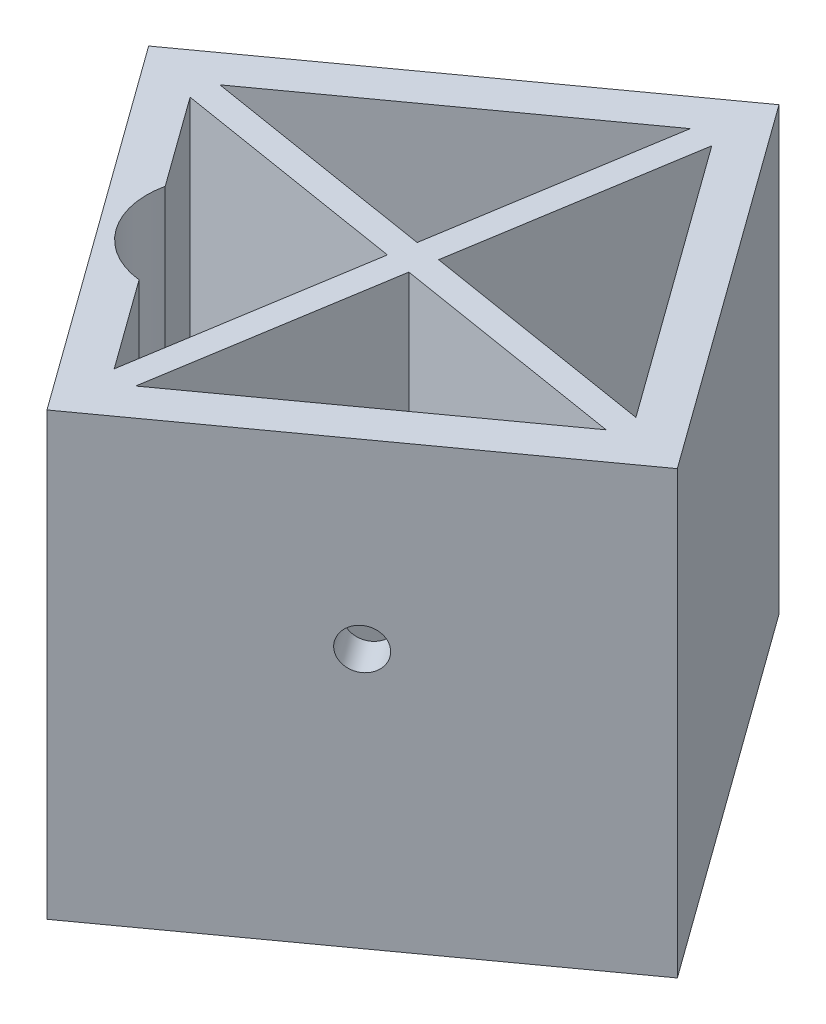
ISO-10303-21;
HEADER;
FILE_DESCRIPTION(('STEP AP214'),'2;1');
FILE_NAME('part.step','',(''),(''),'','','');
FILE_SCHEMA(('AUTOMOTIVE_DESIGN { 1 0 10303 214 1 1 1 1 }'));
ENDSEC;
DATA;
#1=APPLICATION_CONTEXT('core data for automotive mechanical design processes');
#2=APPLICATION_PROTOCOL_DEFINITION('international standard','automotive_design',2000,#1);
#3=PRODUCT_CONTEXT('',#1,'mechanical');
#4=PRODUCT('Part','Part','',(#3));
#5=PRODUCT_RELATED_PRODUCT_CATEGORY('part','',(#4));
#6=PRODUCT_DEFINITION_FORMATION('','',#4);
#7=PRODUCT_DEFINITION_CONTEXT('part definition',#1,'design');
#8=PRODUCT_DEFINITION('design','',#6,#7);
#9=PRODUCT_DEFINITION_SHAPE('','',#8);
#10=(LENGTH_UNIT() NAMED_UNIT(*) SI_UNIT(.MILLI.,.METRE.));
#11=(NAMED_UNIT(*) PLANE_ANGLE_UNIT() SI_UNIT($,.RADIAN.));
#12=(NAMED_UNIT(*) SI_UNIT($,.STERADIAN.) SOLID_ANGLE_UNIT());
#13=UNCERTAINTY_MEASURE_WITH_UNIT(LENGTH_MEASURE(1.E-05),#10,'distance_accuracy_value','');
#14=(GEOMETRIC_REPRESENTATION_CONTEXT(3) GLOBAL_UNCERTAINTY_ASSIGNED_CONTEXT((#13)) GLOBAL_UNIT_ASSIGNED_CONTEXT((#10,
#11,#12)) REPRESENTATION_CONTEXT('',''));
#15=CARTESIAN_POINT('',(0.,0.,0.));
#16=DIRECTION('',(0.,0.,1.));
#17=DIRECTION('',(1.,0.,0.));
#18=AXIS2_PLACEMENT_3D('',#15,#16,#17);
#19=CARTESIAN_POINT('',(0.,2.54,0.));
#20=DIRECTION('',(0.,1.,0.));
#21=DIRECTION('',(0.,0.,1.));
#22=AXIS2_PLACEMENT_3D('',#19,#20,#21);
#23=PLANE('',#22);
#24=DIRECTION('',(0.159232438824621,0.,-0.987241120712647));
#25=VECTOR('',#24,1.);
#26=CARTESIAN_POINT('',(-93.1889043607743,2.54,-15.0304684452862));
#27=LINE('',#26,#25);
#28=CARTESIAN_POINT('',(-108.848549962769,2.54,82.0593342870785));
#29=VERTEX_POINT('',#28);
#30=CARTESIAN_POINT('',(-108.421598003368,2.54,79.4122321387932));
#31=VERTEX_POINT('',#30);
#32=EDGE_CURVE('E342',#29,#31,#27,.T.);
#33=ORIENTED_EDGE('',*,*,#32,.F.);
#34=DIRECTION('',(0.810679228399881,0.,-0.585490553844359));
#35=VECTOR('',#34,1.);
#36=CARTESIAN_POINT('',(-100.626682754743,2.54,76.1213190812824));
#37=LINE('',#36,#35);
#38=CARTESIAN_POINT('',(-105.774495855082,2.54,79.839184098194));
#39=VERTEX_POINT('',#38);
#40=EDGE_CURVE('E333',#29,#39,#37,.T.);
#41=ORIENTED_EDGE('',*,*,#40,.T.);
#42=DIRECTION('',(-0.987241120712647,0.,-0.159232438824621));
#43=VECTOR('',#42,1.);
#44=CARTESIAN_POINT('',(-15.2326936425935,2.54,94.4427005840794));
#45=LINE('',#44,#43);
#46=EDGE_CURVE('E340',#39,#31,#45,.T.);
#47=ORIENTED_EDGE('',*,*,#46,.T.);
#48=EDGE_LOOP('',(#33,#41,#47));
#49=FACE_BOUND('',#48,.T.);
#50=ADVANCED_FACE('F34',(#49),#23,.T.);
#51=DIRECTION('',(0.159232438824621,0.,-0.987241120712647));
#52=VECTOR('',#51,1.);
#53=CARTESIAN_POINT('',(-93.1889043607743,2.54,-15.0304684452862));
#54=LINE('',#53,#52);
#55=CARTESIAN_POINT('',(-108.219372806061,2.54,78.1584359154881));
#56=VERTEX_POINT('',#55);
#57=CARTESIAN_POINT('',(-106.362472763232,2.54,66.6456556499519));
#58=VERTEX_POINT('',#57);
#59=EDGE_CURVE('E350',#56,#58,#54,.T.);
#60=ORIENTED_EDGE('',*,*,#59,.F.);
#61=DIRECTION('',(-0.987241120712647,0.,-0.159232438824621));
#62=VECTOR('',#61,1.);
#63=CARTESIAN_POINT('',(-15.0304684452863,2.54,93.1889043607744));
#64=LINE('',#63,#62);
#65=CARTESIAN_POINT('',(-96.7065925405243,2.54,80.0153359583165));
#66=VERTEX_POINT('',#65);
#67=EDGE_CURVE('E347',#66,#56,#64,.T.);
#68=ORIENTED_EDGE('',*,*,#67,.F.);
#69=DIRECTION('',(-0.585490553844359,0.,-0.81067922839988));
#70=VECTOR('',#69,1.);
#71=CARTESIAN_POINT('',(-96.1808070275254,2.54,80.7433466686227));
#72=LINE('',#71,#70);
#73=EDGE_CURVE('E272',#66,#58,#72,.T.);
#74=ORIENTED_EDGE('',*,*,#73,.T.);
#75=EDGE_LOOP('',(#60,#68,#74));
#76=FACE_BOUND('',#75,.T.);
#77=ADVANCED_FACE('F416',(#76),#23,.T.);
#78=DIRECTION('',(-0.987241120712647,0.,-0.159232438824621));
#79=VECTOR('',#78,1.);
#80=CARTESIAN_POINT('',(-15.2326936425935,2.54,94.4427005840794));
#81=LINE('',#80,#79);
#82=CARTESIAN_POINT('',(-109.675394226673,2.54,79.2100069414859));
#83=VERTEX_POINT('',#82);
#84=CARTESIAN_POINT('',(-121.188174492209,2.54,77.3531068986575));
#85=VERTEX_POINT('',#84);
#86=EDGE_CURVE('E222',#83,#85,#81,.T.);
#87=ORIENTED_EDGE('',*,*,#86,.T.);
#88=DIRECTION('',(0.585490553844354,0.,0.810679228399884));
#89=VECTOR('',#88,1.);
#90=CARTESIAN_POINT('',(-121.713960005208,2.54,76.6250961883513));
#91=LINE('',#90,#89);
#92=CARTESIAN_POINT('',(-118.022197337776,2.54,81.7367675740266));
#93=VERTEX_POINT('',#92);
#94=EDGE_CURVE('E275',#85,#93,#91,.T.);
#95=ORIENTED_EDGE('',*,*,#94,.T.);
#96=CARTESIAN_POINT('',(-114.3,2.54,82.55));
#97=DIRECTION('',(0.,1.,0.));
#98=DIRECTION('',(0.,0.,1.));
#99=AXIS2_PLACEMENT_3D('',#96,#97,#98);
#100=CIRCLE('',#99,3.81);
#101=CARTESIAN_POINT('',(-114.698271423935,2.54,86.3391265316531));
#102=VERTEX_POINT('',#101);
#103=EDGE_CURVE('E278',#93,#102,#100,.T.);
#104=ORIENTED_EDGE('',*,*,#103,.T.);
#105=DIRECTION('',(0.585490553844358,0.,0.810679228399882));
#106=VECTOR('',#105,1.);
#107=CARTESIAN_POINT('',(-114.698271423935,2.54,86.3391265316531));
#108=LINE('',#107,#106);
#109=CARTESIAN_POINT('',(-111.532294269501,2.54,90.7227872070222));
#110=VERTEX_POINT('',#109);
#111=EDGE_CURVE('E259',#102,#110,#108,.T.);
#112=ORIENTED_EDGE('',*,*,#111,.T.);
#113=DIRECTION('',(0.159232438824621,0.,-0.987241120712647));
#114=VECTOR('',#113,1.);
#115=CARTESIAN_POINT('',(-94.4427005840794,2.54,-15.2326936425935));
#116=LINE('',#115,#114);
#117=EDGE_CURVE('E352',#110,#83,#116,.T.);
#118=ORIENTED_EDGE('',*,*,#117,.T.);
#119=EDGE_LOOP('',(#87,#95,#104,#112,#118));
#120=FACE_BOUND('',#119,.T.);
#121=CARTESIAN_POINT('',(-114.3,2.54,82.55));
#122=DIRECTION('',(0.,1.,0.));
#123=DIRECTION('',(0.,0.,1.));
#124=AXIS2_PLACEMENT_3D('',#121,#122,#123);
#125=CIRCLE('',#124,1.5);
#126=CARTESIAN_POINT('',(-114.3,2.54,84.05));
#127=VERTEX_POINT('',#126);
#128=EDGE_CURVE('E300',#127,#127,#125,.T.);
#129=ORIENTED_EDGE('',*,*,#128,.F.);
#130=EDGE_LOOP('',(#129));
#131=FACE_BOUND('',#130,.T.);
#132=ADVANCED_FACE('F410',(#120,#131),#23,.T.);
#133=CARTESIAN_POINT('',(-96.1808070275254,21.59,80.7433466686227));
#134=DIRECTION('',(-0.81067922839988,0.,0.585490553844359));
#135=DIRECTION('',(0.585490553844359,0.,0.81067922839988));
#136=AXIS2_PLACEMENT_3D('',#133,#134,#135);
#137=PLANE('',#136);
#138=ORIENTED_EDGE('',*,*,#73,.F.);
#139=DIRECTION('',(0.,1.,0.));
#140=VECTOR('',#139,1.);
#141=CARTESIAN_POINT('',(-96.7065925405243,-33.5693312311857,80.0153359583166));
#142=LINE('',#141,#140);
#143=CARTESIAN_POINT('',(-96.7065925405243,21.59,80.0153359583166));
#144=VERTEX_POINT('',#143);
#145=EDGE_CURVE('E235',#66,#144,#142,.T.);
#146=ORIENTED_EDGE('',*,*,#145,.T.);
#147=DIRECTION('',(-0.585490553844359,0.,-0.81067922839988));
#148=VECTOR('',#147,1.);
#149=CARTESIAN_POINT('',(-96.1808070275254,21.59,80.7433466686227));
#150=LINE('',#149,#148);
#151=CARTESIAN_POINT('',(-106.362472763232,21.59,66.6456556499519));
#152=VERTEX_POINT('',#151);
#153=EDGE_CURVE('E256',#144,#152,#150,.T.);
#154=ORIENTED_EDGE('',*,*,#153,.T.);
#155=DIRECTION('',(0.,1.,0.));
#156=VECTOR('',#155,1.);
#157=CARTESIAN_POINT('',(-106.362472763232,-33.5693312311857,66.6456556499519));
#158=LINE('',#157,#156);
#159=EDGE_CURVE('E223',#58,#152,#158,.T.);
#160=ORIENTED_EDGE('',*,*,#159,.F.);
#161=EDGE_LOOP('',(#138,#146,#154,#160));
#162=FACE_BOUND('',#161,.T.);
#163=ADVANCED_FACE('F400',(#162),#137,.T.);
#164=CARTESIAN_POINT('',(-106.888258276231,21.59,65.9176449396458));
#165=DIRECTION('',(0.58549055384436,0.,0.81067922839988));
#166=DIRECTION('',(0.81067922839988,0.,-0.58549055384436));
#167=AXIS2_PLACEMENT_3D('',#164,#165,#166);
#168=PLANE('',#167);
#169=CARTESIAN_POINT('',(-114.301109140719,12.7,71.2713705639986));
#170=DIRECTION('',(0.58549055384436,0.,0.81067922839988));
#171=DIRECTION('',(0.81067922839988,0.,-0.58549055384436));
#172=AXIS2_PLACEMENT_3D('',#169,#170,#171);
#173=CIRCLE('',#172,1.);
#174=CARTESIAN_POINT('',(-113.49042991232,12.7,70.6858800101542));
#175=VERTEX_POINT('',#174);
#176=EDGE_CURVE('E364',#175,#175,#173,.T.);
#177=ORIENTED_EDGE('',*,*,#176,.F.);
#178=EDGE_LOOP('',(#177));
#179=FACE_BOUND('',#178,.T.);
#180=DIRECTION('',(0.,1.,0.));
#181=VECTOR('',#180,1.);
#182=CARTESIAN_POINT('',(-120.985949294902,-33.5693312311857,76.0993106753524));
#183=LINE('',#182,#181);
#184=CARTESIAN_POINT('',(-120.985949294902,8.88999999999999,76.0993106753524));
#185=VERTEX_POINT('',#184);
#186=CARTESIAN_POINT('',(-120.985949294902,21.59,76.0993106753524));
#187=VERTEX_POINT('',#186);
#188=EDGE_CURVE('E254',#185,#187,#183,.T.);
#189=ORIENTED_EDGE('',*,*,#188,.F.);
#190=DIRECTION('',(-0.81067922839988,0.,0.58549055384436));
#191=VECTOR('',#190,1.);
#192=CARTESIAN_POINT('',(-107.616268986537,8.89,66.4434304526447));
#193=LINE('',#192,#191);
#194=CARTESIAN_POINT('',(-107.616268986537,8.88999999999999,66.4434304526446));
#195=VERTEX_POINT('',#194);
#196=EDGE_CURVE('E329',#185,#195,#193,.F.);
#197=ORIENTED_EDGE('',*,*,#196,.T.);
#198=DIRECTION('',(0.,1.,0.));
#199=VECTOR('',#198,1.);
#200=CARTESIAN_POINT('',(-107.616268986537,-33.5693312311857,66.4434304526446));
#201=LINE('',#200,#199);
#202=CARTESIAN_POINT('',(-107.616268986537,21.59,66.4434304526447));
#203=VERTEX_POINT('',#202);
#204=EDGE_CURVE('E220',#195,#203,#201,.T.);
#205=ORIENTED_EDGE('',*,*,#204,.T.);
#206=DIRECTION('',(-0.81067922839988,0.,0.58549055384436));
#207=VECTOR('',#206,1.);
#208=CARTESIAN_POINT('',(-106.888258276231,21.59,65.9176449396458));
#209=LINE('',#208,#207);
#210=EDGE_CURVE('E258',#203,#187,#209,.T.);
#211=ORIENTED_EDGE('',*,*,#210,.T.);
#212=EDGE_LOOP('',(#189,#197,#205,#211));
#213=FACE_BOUND('',#212,.T.);
#214=ADVANCED_FACE('F397',(#179,#213),#168,.T.);
#215=CARTESIAN_POINT('',(-111.006508756502,21.59,91.4507979173283));
#216=DIRECTION('',(-0.585490553844359,0.,-0.810679228399881));
#217=DIRECTION('',(-0.810679228399881,0.,0.585490553844359));
#218=AXIS2_PLACEMENT_3D('',#215,#216,#217);
#219=PLANE('',#218);
#220=CARTESIAN_POINT('',(-103.593657892014,12.7,86.0970722929755));
#221=DIRECTION('',(-0.585490553844359,0.,-0.810679228399881));
#222=DIRECTION('',(-0.810679228399881,0.,0.585490553844359));
#223=AXIS2_PLACEMENT_3D('',#220,#221,#222);
#224=CIRCLE('',#223,1.);
#225=CARTESIAN_POINT('',(-104.404337120414,12.7,86.6825628468199));
#226=VERTEX_POINT('',#225);
#227=EDGE_CURVE('E562',#226,#226,#224,.T.);
#228=ORIENTED_EDGE('',*,*,#227,.F.);
#229=EDGE_LOOP('',(#228));
#230=FACE_BOUND('',#229,.T.);
#231=DIRECTION('',(0.,1.,0.));
#232=VECTOR('',#231,1.);
#233=CARTESIAN_POINT('',(-96.9088177378316,-33.5693312311857,81.2691321816216));
#234=LINE('',#233,#232);
#235=CARTESIAN_POINT('',(-96.9088177378316,8.88999999999999,81.2691321816216));
#236=VERTEX_POINT('',#235);
#237=CARTESIAN_POINT('',(-96.9088177378316,21.59,81.2691321816216));
#238=VERTEX_POINT('',#237);
#239=EDGE_CURVE('E237',#236,#238,#234,.T.);
#240=ORIENTED_EDGE('',*,*,#239,.F.);
#241=DIRECTION('',(0.810679228399881,0.,-0.585490553844359));
#242=VECTOR('',#241,1.);
#243=CARTESIAN_POINT('',(-110.278498046196,8.89,90.9250124043294));
#244=LINE('',#243,#242);
#245=CARTESIAN_POINT('',(-110.278498046196,8.88999999999999,90.9250124043294));
#246=VERTEX_POINT('',#245);
#247=EDGE_CURVE('E42',#236,#246,#244,.F.);
#248=ORIENTED_EDGE('',*,*,#247,.T.);
#249=DIRECTION('',(0.,1.,0.));
#250=VECTOR('',#249,1.);
#251=CARTESIAN_POINT('',(-110.278498046196,-33.5693312311857,90.9250124043294));
#252=LINE('',#251,#250);
#253=CARTESIAN_POINT('',(-110.278498046196,21.59,90.9250124043294));
#254=VERTEX_POINT('',#253);
#255=EDGE_CURVE('E243',#246,#254,#252,.T.);
#256=ORIENTED_EDGE('',*,*,#255,.T.);
#257=DIRECTION('',(0.810679228399881,0.,-0.585490553844359));
#258=VECTOR('',#257,1.);
#259=CARTESIAN_POINT('',(-111.006508756502,21.59,91.4507979173283));
#260=LINE('',#259,#258);
#261=EDGE_CURVE('E268',#254,#238,#260,.T.);
#262=ORIENTED_EDGE('',*,*,#261,.T.);
#263=EDGE_LOOP('',(#240,#248,#256,#262));
#264=FACE_BOUND('',#263,.T.);
#265=ADVANCED_FACE('F399',(#230,#264),#219,.T.);
#266=CARTESIAN_POINT('',(-99.9901887217764,2.54,72.2151362990608));
#267=DIRECTION('',(-0.810679228399881,0.,0.585490553844359));
#268=DIRECTION('',(0.585490553844359,0.,0.81067922839988));
#269=AXIS2_PLACEMENT_3D('',#266,#267,#268);
#270=PLANE('',#269);
#271=DIRECTION('',(-0.585490553844359,0.,-0.810679228399881));
#272=VECTOR('',#271,1.);
#273=CARTESIAN_POINT('',(-99.9901887217764,0.,72.2151362990608));
#274=LINE('',#273,#272);
#275=CARTESIAN_POINT('',(-93.5211035923501,0.,81.172331093651));
#276=VERTEX_POINT('',#275);
#277=CARTESIAN_POINT('',(-106.459273851203,0.,63.2579415044705));
#278=VERTEX_POINT('',#277);
#279=EDGE_CURVE('E307',#276,#278,#274,.T.);
#280=ORIENTED_EDGE('',*,*,#279,.T.);
#281=DIRECTION('',(0.,-1.,0.));
#282=VECTOR('',#281,1.);
#283=CARTESIAN_POINT('',(-106.459273851203,2.54,63.2579415044705));
#284=LINE('',#283,#282);
#285=CARTESIAN_POINT('',(-106.459273851203,21.59,63.2579415044705));
#286=VERTEX_POINT('',#285);
#287=EDGE_CURVE('E202',#286,#278,#284,.T.);
#288=ORIENTED_EDGE('',*,*,#287,.F.);
#289=DIRECTION('',(-0.58549055384436,0.,-0.81067922839988));
#290=VECTOR('',#289,1.);
#291=CARTESIAN_POINT('',(-93.5211035923501,21.59,81.172331093651));
#292=LINE('',#291,#290);
#293=CARTESIAN_POINT('',(-93.5211035923501,21.59,81.172331093651));
#294=VERTEX_POINT('',#293);
#295=EDGE_CURVE('E287',#294,#286,#292,.T.);
#296=ORIENTED_EDGE('',*,*,#295,.F.);
#297=DIRECTION('',(0.,-1.,0.));
#298=VECTOR('',#297,1.);
#299=CARTESIAN_POINT('',(-93.5211035923501,2.54,81.172331093651));
#300=LINE('',#299,#298);
#301=EDGE_CURVE('E303',#294,#276,#300,.T.);
#302=ORIENTED_EDGE('',*,*,#301,.T.);
#303=EDGE_LOOP('',(#280,#288,#296,#302));
#304=FACE_BOUND('',#303,.T.);
#305=ADVANCED_FACE('F407',(#304),#270,.F.);
#306=CARTESIAN_POINT('',(-6.46908512942643,2.54,-8.95719479459041));
#307=DIRECTION('',(0.58549055384436,0.,0.81067922839988));
#308=DIRECTION('',(0.81067922839988,0.,-0.58549055384436));
#309=AXIS2_PLACEMENT_3D('',#306,#307,#308);
#310=PLANE('',#309);
#311=CARTESIAN_POINT('',(-115.416468645793,12.7,69.7270266338968));
#312=DIRECTION('',(0.58549055384436,0.,0.81067922839988));
#313=DIRECTION('',(0.81067922839988,0.,-0.58549055384436));
#314=AXIS2_PLACEMENT_3D('',#311,#312,#313);
#315=CIRCLE('',#314,1.);
#316=CARTESIAN_POINT('',(-114.605789417393,12.7,69.1415360800524));
#317=VERTEX_POINT('',#316);
#318=EDGE_CURVE('E565',#317,#317,#315,.T.);
#319=ORIENTED_EDGE('',*,*,#318,.T.);
#320=EDGE_LOOP('',(#319));
#321=FACE_BOUND('',#320,.T.);
#322=DIRECTION('',(-0.81067922839988,0.,0.58549055384436));
#323=VECTOR('',#322,1.);
#324=CARTESIAN_POINT('',(-6.46908512942643,0.,-8.95719479459041));
#325=LINE('',#324,#323);
#326=CARTESIAN_POINT('',(-124.373663440383,0.,76.1961117633231));
#327=VERTEX_POINT('',#326);
#328=EDGE_CURVE('E310',#278,#327,#325,.T.);
#329=ORIENTED_EDGE('',*,*,#328,.T.);
#330=DIRECTION('',(0.,-1.,0.));
#331=VECTOR('',#330,1.);
#332=CARTESIAN_POINT('',(-124.373663440383,2.54,76.1961117633231));
#333=LINE('',#332,#331);
#334=CARTESIAN_POINT('',(-124.373663440383,21.59,76.1961117633231));
#335=VERTEX_POINT('',#334);
#336=EDGE_CURVE('E320',#335,#327,#333,.T.);
#337=ORIENTED_EDGE('',*,*,#336,.F.);
#338=DIRECTION('',(-0.81067922839988,0.,0.58549055384436));
#339=VECTOR('',#338,1.);
#340=CARTESIAN_POINT('',(-106.459273851203,21.59,63.2579415044705));
#341=LINE('',#340,#339);
#342=EDGE_CURVE('E290',#286,#335,#341,.T.);
#343=ORIENTED_EDGE('',*,*,#342,.F.);
#344=ORIENTED_EDGE('',*,*,#287,.T.);
#345=EDGE_LOOP('',(#329,#337,#343,#344));
#346=FACE_BOUND('',#345,.T.);
#347=ADVANCED_FACE('F462',(#321,#346),#310,.F.);
#348=CARTESIAN_POINT('',(-117.904578310957,2.54,85.1533065579128));
#349=DIRECTION('',(0.810679228399884,0.,-0.585490553844355));
#350=DIRECTION('',(-0.585490553844355,0.,-0.810679228399884));
#351=AXIS2_PLACEMENT_3D('',#348,#349,#350);
#352=PLANE('',#351);
#353=DIRECTION('',(0.585490553844355,0.,0.810679228399884));
#354=VECTOR('',#353,1.);
#355=CARTESIAN_POINT('',(-117.904578310957,0.,85.1533065579128));
#356=LINE('',#355,#354);
#357=CARTESIAN_POINT('',(-111.435493181531,0.,94.1105013525036));
#358=VERTEX_POINT('',#357);
#359=EDGE_CURVE('E312',#327,#358,#356,.T.);
#360=ORIENTED_EDGE('',*,*,#359,.T.);
#361=DIRECTION('',(0.,-1.,0.));
#362=VECTOR('',#361,1.);
#363=CARTESIAN_POINT('',(-111.435493181531,2.54,94.1105013525036));
#364=LINE('',#363,#362);
#365=CARTESIAN_POINT('',(-111.435493181531,21.59,94.1105013525036));
#366=VERTEX_POINT('',#365);
#367=EDGE_CURVE('E317',#366,#358,#364,.T.);
#368=ORIENTED_EDGE('',*,*,#367,.F.);
#369=DIRECTION('',(0.585490553844355,0.,0.810679228399884));
#370=VECTOR('',#369,1.);
#371=CARTESIAN_POINT('',(-124.373663440383,21.59,76.1961117633231));
#372=LINE('',#371,#370);
#373=EDGE_CURVE('E293',#335,#366,#372,.T.);
#374=ORIENTED_EDGE('',*,*,#373,.F.);
#375=ORIENTED_EDGE('',*,*,#336,.T.);
#376=EDGE_LOOP('',(#360,#368,#374,#375));
#377=FACE_BOUND('',#376,.T.);
#378=ADVANCED_FACE('F446',(#377),#352,.F.);
#379=CARTESIAN_POINT('',(-114.3,2.54,82.55));
#380=DIRECTION('',(0.,-1.,0.));
#381=DIRECTION('',(0.,0.,-1.));
#382=AXIS2_PLACEMENT_3D('',#379,#380,#381);
#383=CYLINDRICAL_SURFACE('',#382,1.5);
#384=ORIENTED_EDGE('',*,*,#128,.T.);
#385=EDGE_LOOP('',(#384));
#386=FACE_BOUND('',#385,.T.);
#387=CARTESIAN_POINT('',(-114.3,0.,82.55));
#388=DIRECTION('',(0.,1.,0.));
#389=DIRECTION('',(0.,0.,1.));
#390=AXIS2_PLACEMENT_3D('',#387,#388,#389);
#391=CIRCLE('',#390,1.5);
#392=CARTESIAN_POINT('',(-114.3,0.,84.05));
#393=VERTEX_POINT('',#392);
#394=EDGE_CURVE('E299',#393,#393,#391,.T.);
#395=ORIENTED_EDGE('',*,*,#394,.F.);
#396=EDGE_LOOP('',(#395));
#397=FACE_BOUND('',#396,.T.);
#398=ADVANCED_FACE('F432',(#386,#397),#383,.F.);
#399=CARTESIAN_POINT('',(6.46908512942629,2.54,8.95719479459025));
#400=DIRECTION('',(-0.585490553844358,0.,-0.810679228399881));
#401=DIRECTION('',(-0.810679228399881,0.,0.585490553844358));
#402=AXIS2_PLACEMENT_3D('',#399,#400,#401);
#403=PLANE('',#402);
#404=CARTESIAN_POINT('',(-102.47829838694,12.7,87.6414162230773));
#405=DIRECTION('',(0.585490553844359,0.,0.810679228399881));
#406=DIRECTION('',(0.810679228399881,0.,-0.585490553844359));
#407=AXIS2_PLACEMENT_3D('',#404,#405,#406);
#408=CIRCLE('',#407,1.);
#409=CARTESIAN_POINT('',(-101.66761915854,12.7,87.055925669233));
#410=VERTEX_POINT('',#409);
#411=EDGE_CURVE('E213',#410,#410,#408,.T.);
#412=ORIENTED_EDGE('',*,*,#411,.F.);
#413=EDGE_LOOP('',(#412));
#414=FACE_BOUND('',#413,.T.);
#415=DIRECTION('',(0.810679228399881,0.,-0.585490553844359));
#416=VECTOR('',#415,1.);
#417=CARTESIAN_POINT('',(6.46908512942629,0.,8.95719479459025));
#418=LINE('',#417,#416);
#419=EDGE_CURVE('E304',#358,#276,#418,.T.);
#420=ORIENTED_EDGE('',*,*,#419,.T.);
#421=ORIENTED_EDGE('',*,*,#301,.F.);
#422=DIRECTION('',(0.810679228399881,0.,-0.585490553844359));
#423=VECTOR('',#422,1.);
#424=CARTESIAN_POINT('',(-111.435493181531,21.59,94.1105013525036));
#425=LINE('',#424,#423);
#426=EDGE_CURVE('E296',#366,#294,#425,.T.);
#427=ORIENTED_EDGE('',*,*,#426,.F.);
#428=ORIENTED_EDGE('',*,*,#367,.T.);
#429=EDGE_LOOP('',(#420,#421,#427,#428));
#430=FACE_BOUND('',#429,.T.);
#431=ADVANCED_FACE('F426',(#414,#430),#403,.F.);
#432=DIRECTION('',(0.159232438824621,0.,-0.987241120712647));
#433=VECTOR('',#432,1.);
#434=CARTESIAN_POINT('',(-94.4427005840794,2.54,-15.2326936425935));
#435=LINE('',#434,#433);
#436=CARTESIAN_POINT('',(-109.473169029366,2.54,77.9562107181809));
#437=VERTEX_POINT('',#436);
#438=CARTESIAN_POINT('',(-109.046217069965,2.54,75.3091085698956));
#439=VERTEX_POINT('',#438);
#440=EDGE_CURVE('E358',#437,#439,#435,.T.);
#441=ORIENTED_EDGE('',*,*,#440,.T.);
#442=DIRECTION('',(-0.81067922839988,0.,0.58549055384436));
#443=VECTOR('',#442,1.);
#444=CARTESIAN_POINT('',(-117.26808427799,2.54,81.2471237756917));
#445=LINE('',#444,#443);
#446=CARTESIAN_POINT('',(-112.120271177651,2.54,77.52925875878));
#447=VERTEX_POINT('',#446);
#448=EDGE_CURVE('E201',#439,#447,#445,.T.);
#449=ORIENTED_EDGE('',*,*,#448,.T.);
#450=DIRECTION('',(-0.987241120712647,0.,-0.159232438824621));
#451=VECTOR('',#450,1.);
#452=CARTESIAN_POINT('',(-15.0304684452863,2.54,93.1889043607744));
#453=LINE('',#452,#451);
#454=EDGE_CURVE('E276',#437,#447,#453,.T.);
#455=ORIENTED_EDGE('',*,*,#454,.F.);
#456=EDGE_LOOP('',(#441,#449,#455));
#457=FACE_BOUND('',#456,.T.);
#458=ADVANCED_FACE('F395',(#457),#23,.T.);
#459=CARTESIAN_POINT('',(0.,0.,0.));
#460=DIRECTION('',(0.,1.,0.));
#461=DIRECTION('',(0.,0.,1.));
#462=AXIS2_PLACEMENT_3D('',#459,#460,#461);
#463=PLANE('',#462);
#464=ORIENTED_EDGE('',*,*,#394,.T.);
#465=EDGE_LOOP('',(#464));
#466=FACE_BOUND('',#465,.T.);
#467=ORIENTED_EDGE('',*,*,#279,.F.);
#468=ORIENTED_EDGE('',*,*,#419,.F.);
#469=ORIENTED_EDGE('',*,*,#359,.F.);
#470=ORIENTED_EDGE('',*,*,#328,.F.);
#471=EDGE_LOOP('',(#467,#468,#469,#470));
#472=FACE_BOUND('',#471,.T.);
#473=ADVANCED_FACE('F425',(#466,#472),#463,.F.);
#474=CARTESIAN_POINT('',(0.,21.59,0.));
#475=DIRECTION('',(0.,1.,0.));
#476=DIRECTION('',(0.,0.,1.));
#477=AXIS2_PLACEMENT_3D('',#474,#475,#476);
#478=PLANE('',#477);
#479=ORIENTED_EDGE('',*,*,#153,.F.);
#480=DIRECTION('',(0.987241120712647,0.,0.159232438824621));
#481=VECTOR('',#480,1.);
#482=CARTESIAN_POINT('',(-15.0304684452863,21.59,93.1889043607744));
#483=LINE('',#482,#481);
#484=CARTESIAN_POINT('',(-108.219372806061,21.59,78.1584359154881));
#485=VERTEX_POINT('',#484);
#486=EDGE_CURVE('E376',#485,#144,#483,.T.);
#487=ORIENTED_EDGE('',*,*,#486,.F.);
#488=DIRECTION('',(-0.159232438824621,0.,0.987241120712647));
#489=VECTOR('',#488,1.);
#490=CARTESIAN_POINT('',(-93.1889043607743,21.59,-15.0304684452862));
#491=LINE('',#490,#489);
#492=EDGE_CURVE('E378',#152,#485,#491,.T.);
#493=ORIENTED_EDGE('',*,*,#492,.F.);
#494=EDGE_LOOP('',(#479,#487,#493));
#495=FACE_BOUND('',#494,.T.);
#496=ORIENTED_EDGE('',*,*,#210,.F.);
#497=DIRECTION('',(-0.159232438824621,0.,0.987241120712647));
#498=VECTOR('',#497,1.);
#499=CARTESIAN_POINT('',(-94.4427005840794,21.59,-15.2326936425935));
#500=LINE('',#499,#498);
#501=CARTESIAN_POINT('',(-109.473169029366,21.59,77.9562107181809));
#502=VERTEX_POINT('',#501);
#503=EDGE_CURVE('E226',#203,#502,#500,.T.);
#504=ORIENTED_EDGE('',*,*,#503,.T.);
#505=DIRECTION('',(0.987241120712647,0.,0.159232438824621));
#506=VECTOR('',#505,1.);
#507=CARTESIAN_POINT('',(-15.0304684452863,21.59,93.1889043607744));
#508=LINE('',#507,#506);
#509=EDGE_CURVE('E218',#187,#502,#508,.T.);
#510=ORIENTED_EDGE('',*,*,#509,.F.);
#511=EDGE_LOOP('',(#496,#504,#510));
#512=FACE_BOUND('',#511,.T.);
#513=DIRECTION('',(0.585490553844354,0.,0.810679228399884));
#514=VECTOR('',#513,1.);
#515=CARTESIAN_POINT('',(-121.713960005208,21.59,76.6250961883513));
#516=LINE('',#515,#514);
#517=CARTESIAN_POINT('',(-121.188174492209,21.59,77.3531068986575));
#518=VERTEX_POINT('',#517);
#519=CARTESIAN_POINT('',(-118.022197337776,21.59,81.7367675740266));
#520=VERTEX_POINT('',#519);
#521=EDGE_CURVE('E262',#518,#520,#516,.T.);
#522=ORIENTED_EDGE('',*,*,#521,.F.);
#523=DIRECTION('',(0.987241120712647,0.,0.159232438824621));
#524=VECTOR('',#523,1.);
#525=CARTESIAN_POINT('',(-15.2326936425935,21.59,94.4427005840794));
#526=LINE('',#525,#524);
#527=CARTESIAN_POINT('',(-109.675394226673,21.59,79.2100069414859));
#528=VERTEX_POINT('',#527);
#529=EDGE_CURVE('E363',#518,#528,#526,.T.);
#530=ORIENTED_EDGE('',*,*,#529,.T.);
#531=DIRECTION('',(-0.159232438824621,0.,0.987241120712647));
#532=VECTOR('',#531,1.);
#533=CARTESIAN_POINT('',(-94.4427005840794,21.59,-15.2326936425935));
#534=LINE('',#533,#532);
#535=CARTESIAN_POINT('',(-111.532294269501,21.59,90.7227872070222));
#536=VERTEX_POINT('',#535);
#537=EDGE_CURVE('E367',#528,#536,#534,.T.);
#538=ORIENTED_EDGE('',*,*,#537,.T.);
#539=DIRECTION('',(0.585490553844358,0.,0.810679228399882));
#540=VECTOR('',#539,1.);
#541=CARTESIAN_POINT('',(-114.698271423935,21.59,86.3391265316531));
#542=LINE('',#541,#540);
#543=CARTESIAN_POINT('',(-114.698271423935,21.59,86.3391265316531));
#544=VERTEX_POINT('',#543);
#545=EDGE_CURVE('E266',#544,#536,#542,.T.);
#546=ORIENTED_EDGE('',*,*,#545,.F.);
#547=CARTESIAN_POINT('',(-114.3,21.59,82.55));
#548=DIRECTION('',(0.,1.,0.));
#549=DIRECTION('',(0.,0.,1.));
#550=AXIS2_PLACEMENT_3D('',#547,#548,#549);
#551=CIRCLE('',#550,3.81);
#552=EDGE_CURVE('E264',#520,#544,#551,.T.);
#553=ORIENTED_EDGE('',*,*,#552,.F.);
#554=EDGE_LOOP('',(#522,#530,#538,#546,#553));
#555=FACE_BOUND('',#554,.T.);
#556=ORIENTED_EDGE('',*,*,#261,.F.);
#557=DIRECTION('',(-0.159232438824621,0.,0.987241120712647));
#558=VECTOR('',#557,1.);
#559=CARTESIAN_POINT('',(-93.1889043607743,21.59,-15.0304684452862));
#560=LINE('',#559,#558);
#561=CARTESIAN_POINT('',(-108.421598003368,21.59,79.4122321387932));
#562=VERTEX_POINT('',#561);
#563=EDGE_CURVE('E370',#562,#254,#560,.T.);
#564=ORIENTED_EDGE('',*,*,#563,.F.);
#565=DIRECTION('',(0.987241120712647,0.,0.159232438824621));
#566=VECTOR('',#565,1.);
#567=CARTESIAN_POINT('',(-15.2326936425935,21.59,94.4427005840794));
#568=LINE('',#567,#566);
#569=EDGE_CURVE('E373',#562,#238,#568,.T.);
#570=ORIENTED_EDGE('',*,*,#569,.T.);
#571=EDGE_LOOP('',(#556,#564,#570));
#572=FACE_BOUND('',#571,.T.);
#573=ORIENTED_EDGE('',*,*,#295,.T.);
#574=ORIENTED_EDGE('',*,*,#342,.T.);
#575=ORIENTED_EDGE('',*,*,#373,.T.);
#576=ORIENTED_EDGE('',*,*,#426,.T.);
#577=EDGE_LOOP('',(#573,#574,#575,#576));
#578=FACE_BOUND('',#577,.T.);
#579=ADVANCED_FACE('F386',(#495,#512,#555,#572,#578),#478,.T.);
#580=CARTESIAN_POINT('',(-121.713960005208,21.59,76.6250961883513));
#581=DIRECTION('',(0.810679228399884,0.,-0.585490553844354));
#582=DIRECTION('',(-0.585490553844354,0.,-0.810679228399884));
#583=AXIS2_PLACEMENT_3D('',#580,#581,#582);
#584=PLANE('',#583);
#585=DIRECTION('',(0.,1.,0.));
#586=VECTOR('',#585,1.);
#587=CARTESIAN_POINT('',(-121.188174492209,-33.5693312311857,77.3531068986575));
#588=LINE('',#587,#586);
#589=EDGE_CURVE('E252',#85,#518,#588,.T.);
#590=ORIENTED_EDGE('',*,*,#589,.T.);
#591=ORIENTED_EDGE('',*,*,#521,.T.);
#592=DIRECTION('',(0.,-1.,0.));
#593=VECTOR('',#592,1.);
#594=CARTESIAN_POINT('',(-118.022197337776,21.59,81.7367675740266));
#595=LINE('',#594,#593);
#596=EDGE_CURVE('E284',#520,#93,#595,.T.);
#597=ORIENTED_EDGE('',*,*,#596,.T.);
#598=ORIENTED_EDGE('',*,*,#94,.F.);
#599=EDGE_LOOP('',(#590,#591,#597,#598));
#600=FACE_BOUND('',#599,.T.);
#601=ADVANCED_FACE('F537',(#600),#584,.T.);
#602=CARTESIAN_POINT('',(-114.3,21.59,82.55));
#603=DIRECTION('',(0.,-1.,0.));
#604=DIRECTION('',(0.,0.,-1.));
#605=AXIS2_PLACEMENT_3D('',#602,#603,#604);
#606=CYLINDRICAL_SURFACE('',#605,3.81);
#607=ORIENTED_EDGE('',*,*,#103,.F.);
#608=ORIENTED_EDGE('',*,*,#596,.F.);
#609=ORIENTED_EDGE('',*,*,#552,.T.);
#610=DIRECTION('',(0.,-1.,0.));
#611=VECTOR('',#610,1.);
#612=CARTESIAN_POINT('',(-114.698271423935,21.59,86.3391265316531));
#613=LINE('',#612,#611);
#614=EDGE_CURVE('E271',#544,#102,#613,.T.);
#615=ORIENTED_EDGE('',*,*,#614,.T.);
#616=EDGE_LOOP('',(#607,#608,#609,#615));
#617=FACE_BOUND('',#616,.T.);
#618=ADVANCED_FACE('F534',(#617),#606,.F.);
#619=CARTESIAN_POINT('',(-114.698271423935,21.59,86.3391265316531));
#620=DIRECTION('',(0.810679228399882,0.,-0.585490553844358));
#621=DIRECTION('',(-0.585490553844358,0.,-0.810679228399882));
#622=AXIS2_PLACEMENT_3D('',#619,#620,#621);
#623=PLANE('',#622);
#624=DIRECTION('',(0.,1.,0.));
#625=VECTOR('',#624,1.);
#626=CARTESIAN_POINT('',(-111.532294269501,-33.5693312311857,90.7227872070222));
#627=LINE('',#626,#625);
#628=EDGE_CURVE('E245',#110,#536,#627,.T.);
#629=ORIENTED_EDGE('',*,*,#628,.F.);
#630=ORIENTED_EDGE('',*,*,#111,.F.);
#631=ORIENTED_EDGE('',*,*,#614,.F.);
#632=ORIENTED_EDGE('',*,*,#545,.T.);
#633=EDGE_LOOP('',(#629,#630,#631,#632));
#634=FACE_BOUND('',#633,.T.);
#635=ADVANCED_FACE('F529',(#634),#623,.T.);
#636=CARTESIAN_POINT('',(-15.2326936425935,-33.5693312311857,94.4427005840794));
#637=DIRECTION('',(-0.159232438824621,0.,0.987241120712647));
#638=DIRECTION('',(0.987241120712647,0.,0.159232438824621));
#639=AXIS2_PLACEMENT_3D('',#636,#637,#638);
#640=PLANE('',#639);
#641=CARTESIAN_POINT('',(-108.421598003368,12.7,79.4122321387932));
#642=DIRECTION('',(-0.159232438824621,0.,0.987241120712647));
#643=DIRECTION('',(0.987241120712647,0.,0.159232438824621));
#644=AXIS2_PLACEMENT_3D('',#641,#642,#643);
#645=ELLIPSE('',#644,1.4142135623731,1.);
#646=CARTESIAN_POINT('',(-109.675394226673,13.1399431781491,79.2100069414859));
#647=VERTEX_POINT('',#646);
#648=CARTESIAN_POINT('',(-109.675394226673,12.2600568218508,79.2100069414859));
#649=VERTEX_POINT('',#648);
#650=EDGE_CURVE('E497',#647,#649,#645,.T.);
#651=ORIENTED_EDGE('',*,*,#650,.F.);
#652=DIRECTION('',(0.,1.,0.));
#653=VECTOR('',#652,1.);
#654=CARTESIAN_POINT('',(-109.675394226673,-33.5693312311857,79.2100069414859));
#655=LINE('',#654,#653);
#656=EDGE_CURVE('E251',#647,#528,#655,.T.);
#657=ORIENTED_EDGE('',*,*,#656,.T.);
#658=ORIENTED_EDGE('',*,*,#529,.F.);
#659=ORIENTED_EDGE('',*,*,#589,.F.);
#660=ORIENTED_EDGE('',*,*,#86,.F.);
#661=EDGE_CURVE('E248',#83,#649,#655,.T.);
#662=ORIENTED_EDGE('',*,*,#661,.T.);
#663=EDGE_LOOP('',(#651,#657,#658,#659,#660,#662));
#664=FACE_BOUND('',#663,.T.);
#665=ADVANCED_FACE('F526',(#664),#640,.T.);
#666=CARTESIAN_POINT('',(-94.4427005840794,-33.5693312311857,-15.2326936425935));
#667=DIRECTION('',(-0.987241120712647,0.,-0.159232438824621));
#668=DIRECTION('',(-0.159232438824621,0.,0.987241120712647));
#669=AXIS2_PLACEMENT_3D('',#666,#667,#668);
#670=PLANE('',#669);
#671=CARTESIAN_POINT('',(-109.473169029366,12.7,77.9562107181808));
#672=DIRECTION('',(-0.987241120712647,0.,-0.159232438824621));
#673=DIRECTION('',(-0.159232438824621,0.,0.987241120712647));
#674=AXIS2_PLACEMENT_3D('',#671,#672,#673);
#675=ELLIPSE('',#674,1.4142135623731,1.);
#676=EDGE_CURVE('E568',#649,#647,#675,.T.);
#677=ORIENTED_EDGE('',*,*,#676,.F.);
#678=ORIENTED_EDGE('',*,*,#661,.F.);
#679=ORIENTED_EDGE('',*,*,#117,.F.);
#680=ORIENTED_EDGE('',*,*,#628,.T.);
#681=ORIENTED_EDGE('',*,*,#537,.F.);
#682=ORIENTED_EDGE('',*,*,#656,.F.);
#683=EDGE_LOOP('',(#677,#678,#679,#680,#681,#682));
#684=FACE_BOUND('',#683,.T.);
#685=ADVANCED_FACE('F522',(#684),#670,.T.);
#686=CARTESIAN_POINT('',(-93.1889043607743,-33.5693312311857,-15.0304684452862));
#687=DIRECTION('',(-0.987241120712647,0.,-0.159232438824621));
#688=DIRECTION('',(-0.159232438824621,0.,0.987241120712647));
#689=AXIS2_PLACEMENT_3D('',#686,#687,#688);
#690=PLANE('',#689);
#691=ORIENTED_EDGE('',*,*,#255,.F.);
#692=CARTESIAN_POINT('',(-108.848549962769,8.89,82.0593342870785));
#693=DIRECTION('',(-0.987241120712647,0.,-0.159232438824621));
#694=DIRECTION('',(-0.159232438824621,0.,0.987241120712647));
#695=AXIS2_PLACEMENT_3D('',#692,#693,#694);
#696=ELLIPSE('',#695,8.98025612106916,6.35);
#697=EDGE_CURVE('E11',#246,#29,#696,.F.);
#698=ORIENTED_EDGE('',*,*,#697,.T.);
#699=ORIENTED_EDGE('',*,*,#32,.T.);
#700=DIRECTION('',(0.,1.,0.));
#701=VECTOR('',#700,1.);
#702=CARTESIAN_POINT('',(-108.421598003368,-33.5693312311857,79.4122321387932));
#703=LINE('',#702,#701);
#704=CARTESIAN_POINT('',(-108.421598003368,11.7,79.4122321387932));
#705=VERTEX_POINT('',#704);
#706=EDGE_CURVE('E239',#31,#705,#703,.T.);
#707=ORIENTED_EDGE('',*,*,#706,.T.);
#708=CARTESIAN_POINT('',(-108.421598003368,12.7,79.4122321387932));
#709=DIRECTION('',(-0.987241120712647,0.,-0.159232438824621));
#710=DIRECTION('',(-0.159232438824621,0.,0.987241120712647));
#711=AXIS2_PLACEMENT_3D('',#708,#709,#710);
#712=ELLIPSE('',#711,1.4142135623731,1.);
#713=CARTESIAN_POINT('',(-108.421598003368,13.7,79.4122321387932));
#714=VERTEX_POINT('',#713);
#715=EDGE_CURVE('E570',#705,#714,#712,.T.);
#716=ORIENTED_EDGE('',*,*,#715,.T.);
#717=EDGE_CURVE('E242',#714,#562,#703,.T.);
#718=ORIENTED_EDGE('',*,*,#717,.T.);
#719=ORIENTED_EDGE('',*,*,#563,.T.);
#720=EDGE_LOOP('',(#691,#698,#699,#707,#716,#718,#719));
#721=FACE_BOUND('',#720,.T.);
#722=ADVANCED_FACE('F519',(#721),#690,.F.);
#723=CARTESIAN_POINT('',(-15.2326936425935,-33.5693312311857,94.4427005840794));
#724=DIRECTION('',(-0.159232438824621,0.,0.987241120712647));
#725=DIRECTION('',(0.987241120712647,0.,0.159232438824621));
#726=AXIS2_PLACEMENT_3D('',#723,#724,#725);
#727=PLANE('',#726);
#728=ORIENTED_EDGE('',*,*,#46,.F.);
#729=CARTESIAN_POINT('',(-105.774495855083,8.89,79.8391840981941));
#730=DIRECTION('',(-0.159232438824621,0.,0.987241120712647));
#731=DIRECTION('',(-0.987241120712647,0.,-0.159232438824621));
#732=AXIS2_PLACEMENT_3D('',#729,#730,#731);
#733=ELLIPSE('',#732,8.98025612106914,6.35);
#734=EDGE_CURVE('E56',#39,#236,#733,.T.);
#735=ORIENTED_EDGE('',*,*,#734,.T.);
#736=ORIENTED_EDGE('',*,*,#239,.T.);
#737=ORIENTED_EDGE('',*,*,#569,.F.);
#738=ORIENTED_EDGE('',*,*,#717,.F.);
#739=CARTESIAN_POINT('',(-108.421598003368,12.7,79.4122321387932));
#740=DIRECTION('',(-0.159232438824621,0.,0.987241120712647));
#741=DIRECTION('',(0.987241120712647,0.,0.159232438824621));
#742=AXIS2_PLACEMENT_3D('',#739,#740,#741);
#743=ELLIPSE('',#742,1.4142135623731,1.);
#744=EDGE_CURVE('E506',#705,#714,#743,.T.);
#745=ORIENTED_EDGE('',*,*,#744,.F.);
#746=ORIENTED_EDGE('',*,*,#706,.F.);
#747=EDGE_LOOP('',(#728,#735,#736,#737,#738,#745,#746));
#748=FACE_BOUND('',#747,.T.);
#749=ADVANCED_FACE('F345',(#748),#727,.T.);
#750=CARTESIAN_POINT('',(-15.0304684452863,-33.5693312311857,93.1889043607744));
#751=DIRECTION('',(-0.159232438824621,0.,0.987241120712647));
#752=DIRECTION('',(0.987241120712647,0.,0.159232438824621));
#753=AXIS2_PLACEMENT_3D('',#750,#751,#752);
#754=PLANE('',#753);
#755=DIRECTION('',(0.,1.,0.));
#756=VECTOR('',#755,1.);
#757=CARTESIAN_POINT('',(-108.219372806061,-33.5693312311857,78.1584359154881));
#758=LINE('',#757,#756);
#759=CARTESIAN_POINT('',(-108.219372806061,12.2600568218508,78.1584359154881));
#760=VERTEX_POINT('',#759);
#761=EDGE_CURVE('E231',#56,#760,#758,.T.);
#762=ORIENTED_EDGE('',*,*,#761,.T.);
#763=CARTESIAN_POINT('',(-109.473169029366,12.7,77.9562107181809));
#764=DIRECTION('',(-0.159232438824621,0.,0.987241120712647));
#765=DIRECTION('',(0.987241120712647,0.,0.159232438824621));
#766=AXIS2_PLACEMENT_3D('',#763,#764,#765);
#767=ELLIPSE('',#766,1.4142135623731,1.);
#768=CARTESIAN_POINT('',(-108.219372806061,13.1399431781491,78.1584359154881));
#769=VERTEX_POINT('',#768);
#770=EDGE_CURVE('E501',#760,#769,#767,.T.);
#771=ORIENTED_EDGE('',*,*,#770,.T.);
#772=EDGE_CURVE('E234',#769,#485,#758,.T.);
#773=ORIENTED_EDGE('',*,*,#772,.T.);
#774=ORIENTED_EDGE('',*,*,#486,.T.);
#775=ORIENTED_EDGE('',*,*,#145,.F.);
#776=ORIENTED_EDGE('',*,*,#67,.T.);
#777=EDGE_LOOP('',(#762,#771,#773,#774,#775,#776));
#778=FACE_BOUND('',#777,.T.);
#779=ADVANCED_FACE('F505',(#778),#754,.F.);
#780=CARTESIAN_POINT('',(-93.1889043607743,-33.5693312311857,-15.0304684452862));
#781=DIRECTION('',(-0.987241120712647,0.,-0.159232438824621));
#782=DIRECTION('',(-0.159232438824621,0.,0.987241120712647));
#783=AXIS2_PLACEMENT_3D('',#780,#781,#782);
#784=PLANE('',#783);
#785=ORIENTED_EDGE('',*,*,#772,.F.);
#786=CARTESIAN_POINT('',(-108.421598003368,12.7,79.4122321387932));
#787=DIRECTION('',(-0.987241120712647,0.,-0.159232438824621));
#788=DIRECTION('',(-0.159232438824621,0.,0.987241120712647));
#789=AXIS2_PLACEMENT_3D('',#786,#787,#788);
#790=ELLIPSE('',#789,1.4142135623731,1.);
#791=EDGE_CURVE('E212',#769,#760,#790,.T.);
#792=ORIENTED_EDGE('',*,*,#791,.T.);
#793=ORIENTED_EDGE('',*,*,#761,.F.);
#794=ORIENTED_EDGE('',*,*,#59,.T.);
#795=ORIENTED_EDGE('',*,*,#159,.T.);
#796=ORIENTED_EDGE('',*,*,#492,.T.);
#797=EDGE_LOOP('',(#785,#792,#793,#794,#795,#796));
#798=FACE_BOUND('',#797,.T.);
#799=ADVANCED_FACE('F508',(#798),#784,.F.);
#800=CARTESIAN_POINT('',(-94.4427005840794,-33.5693312311857,-15.2326936425935));
#801=DIRECTION('',(-0.987241120712647,0.,-0.159232438824621));
#802=DIRECTION('',(-0.159232438824621,0.,0.987241120712647));
#803=AXIS2_PLACEMENT_3D('',#800,#801,#802);
#804=PLANE('',#803);
#805=ORIENTED_EDGE('',*,*,#204,.F.);
#806=CARTESIAN_POINT('',(-109.046217069965,8.89,75.3091085698956));
#807=DIRECTION('',(-0.987241120712647,0.,-0.159232438824621));
#808=DIRECTION('',(0.159232438824621,0.,-0.987241120712647));
#809=AXIS2_PLACEMENT_3D('',#806,#807,#808);
#810=ELLIPSE('',#809,8.98025612106917,6.35);
#811=EDGE_CURVE('E331',#195,#439,#810,.T.);
#812=ORIENTED_EDGE('',*,*,#811,.T.);
#813=ORIENTED_EDGE('',*,*,#440,.F.);
#814=DIRECTION('',(0.,1.,0.));
#815=VECTOR('',#814,1.);
#816=CARTESIAN_POINT('',(-109.473169029366,-33.5693312311857,77.9562107181809));
#817=LINE('',#816,#815);
#818=CARTESIAN_POINT('',(-109.473169029366,11.7,77.9562107181809));
#819=VERTEX_POINT('',#818);
#820=EDGE_CURVE('E211',#437,#819,#817,.T.);
#821=ORIENTED_EDGE('',*,*,#820,.T.);
#822=CARTESIAN_POINT('',(-109.473169029366,12.7,77.9562107181808));
#823=DIRECTION('',(-0.987241120712647,0.,-0.159232438824621));
#824=DIRECTION('',(-0.159232438824621,0.,0.987241120712647));
#825=AXIS2_PLACEMENT_3D('',#822,#823,#824);
#826=ELLIPSE('',#825,1.4142135623731,1.);
#827=CARTESIAN_POINT('',(-109.473169029366,13.7,77.9562107181809));
#828=VERTEX_POINT('',#827);
#829=EDGE_CURVE('E196',#828,#819,#826,.T.);
#830=ORIENTED_EDGE('',*,*,#829,.F.);
#831=EDGE_CURVE('E208',#828,#502,#817,.T.);
#832=ORIENTED_EDGE('',*,*,#831,.T.);
#833=ORIENTED_EDGE('',*,*,#503,.F.);
#834=EDGE_LOOP('',(#805,#812,#813,#821,#830,#832,#833));
#835=FACE_BOUND('',#834,.T.);
#836=ADVANCED_FACE('F206',(#835),#804,.T.);
#837=CARTESIAN_POINT('',(-15.0304684452863,-33.5693312311857,93.1889043607744));
#838=DIRECTION('',(-0.159232438824621,0.,0.987241120712647));
#839=DIRECTION('',(0.987241120712647,0.,0.159232438824621));
#840=AXIS2_PLACEMENT_3D('',#837,#838,#839);
#841=PLANE('',#840);
#842=ORIENTED_EDGE('',*,*,#454,.T.);
#843=CARTESIAN_POINT('',(-112.120271177651,8.89,77.52925875878));
#844=DIRECTION('',(-0.159232438824621,0.,0.987241120712647));
#845=DIRECTION('',(0.987241120712647,0.,0.159232438824621));
#846=AXIS2_PLACEMENT_3D('',#843,#844,#845);
#847=ELLIPSE('',#846,8.98025612106913,6.35);
#848=EDGE_CURVE('E327',#447,#185,#847,.F.);
#849=ORIENTED_EDGE('',*,*,#848,.T.);
#850=ORIENTED_EDGE('',*,*,#188,.T.);
#851=ORIENTED_EDGE('',*,*,#509,.T.);
#852=ORIENTED_EDGE('',*,*,#831,.F.);
#853=CARTESIAN_POINT('',(-109.473169029366,12.7,77.9562107181809));
#854=DIRECTION('',(-0.159232438824621,0.,0.987241120712647));
#855=DIRECTION('',(0.987241120712647,0.,0.159232438824621));
#856=AXIS2_PLACEMENT_3D('',#853,#854,#855);
#857=ELLIPSE('',#856,1.4142135623731,1.);
#858=EDGE_CURVE('E192',#828,#819,#857,.T.);
#859=ORIENTED_EDGE('',*,*,#858,.T.);
#860=ORIENTED_EDGE('',*,*,#820,.F.);
#861=EDGE_LOOP('',(#842,#849,#850,#851,#852,#859,#860));
#862=FACE_BOUND('',#861,.T.);
#863=ADVANCED_FACE('F216',(#862),#841,.F.);
#864=CARTESIAN_POINT('',(-121.557506861962,12.7,61.2240506422776));
#865=DIRECTION('',(0.585490553844359,0.,0.810679228399881));
#866=DIRECTION('',(0.810679228399881,0.,-0.585490553844359));
#867=AXIS2_PLACEMENT_3D('',#864,#865,#866);
#868=CYLINDRICAL_SURFACE('',#867,1.);
#869=ORIENTED_EDGE('',*,*,#650,.T.);
#870=ORIENTED_EDGE('',*,*,#676,.T.);
#871=EDGE_LOOP('',(#869,#870));
#872=FACE_BOUND('',#871,.T.);
#873=ORIENTED_EDGE('',*,*,#791,.F.);
#874=ORIENTED_EDGE('',*,*,#770,.F.);
#875=EDGE_LOOP('',(#873,#874));
#876=FACE_BOUND('',#875,.T.);
#877=ORIENTED_EDGE('',*,*,#829,.T.);
#878=ORIENTED_EDGE('',*,*,#858,.F.);
#879=EDGE_LOOP('',(#877,#878));
#880=FACE_BOUND('',#879,.T.);
#881=ORIENTED_EDGE('',*,*,#744,.T.);
#882=ORIENTED_EDGE('',*,*,#715,.F.);
#883=EDGE_LOOP('',(#881,#882));
#884=FACE_BOUND('',#883,.T.);
#885=ADVANCED_FACE('F194',(#872,#876,#880,#884),#868,.F.);
#886=ORIENTED_EDGE('',*,*,#227,.T.);
#887=EDGE_LOOP('',(#886));
#888=FACE_BOUND('',#887,.T.);
#889=ORIENTED_EDGE('',*,*,#411,.T.);
#890=EDGE_LOOP('',(#889));
#891=FACE_BOUND('',#890,.T.);
#892=ADVANCED_FACE('F479',(#888,#891),#868,.F.);
#893=ORIENTED_EDGE('',*,*,#176,.T.);
#894=EDGE_LOOP('',(#893));
#895=FACE_BOUND('',#894,.T.);
#896=ORIENTED_EDGE('',*,*,#318,.F.);
#897=EDGE_LOOP('',(#896));
#898=FACE_BOUND('',#897,.T.);
#899=ADVANCED_FACE('F474',(#895,#898),#868,.F.);
#900=CARTESIAN_POINT('',(-1.63586060744126,8.89,-2.26503776414943));
#901=DIRECTION('',(0.81067922839988,0.,-0.58549055384436));
#902=DIRECTION('',(-0.58549055384436,0.,-0.81067922839988));
#903=AXIS2_PLACEMENT_3D('',#900,#901,#902);
#904=CYLINDRICAL_SURFACE('',#903,6.35);
#905=ORIENTED_EDGE('',*,*,#811,.F.);
#906=ORIENTED_EDGE('',*,*,#196,.F.);
#907=ORIENTED_EDGE('',*,*,#848,.F.);
#908=ORIENTED_EDGE('',*,*,#448,.F.);
#909=EDGE_LOOP('',(#905,#906,#907,#908));
#910=FACE_BOUND('',#909,.T.);
#911=ADVANCED_FACE('F393',(#910),#904,.F.);
#912=CARTESIAN_POINT('',(1.63586060744108,8.89,2.26503776414918));
#913=DIRECTION('',(-0.810679228399881,0.,0.585490553844359));
#914=DIRECTION('',(0.585490553844359,0.,0.810679228399881));
#915=AXIS2_PLACEMENT_3D('',#912,#913,#914);
#916=CYLINDRICAL_SURFACE('',#915,6.35);
#917=ORIENTED_EDGE('',*,*,#697,.F.);
#918=ORIENTED_EDGE('',*,*,#247,.F.);
#919=ORIENTED_EDGE('',*,*,#734,.F.);
#920=ORIENTED_EDGE('',*,*,#40,.F.);
#921=EDGE_LOOP('',(#917,#918,#919,#920));
#922=FACE_BOUND('',#921,.T.);
#923=ADVANCED_FACE('F36',(#922),#916,.F.);
#924=CLOSED_SHELL('',(#50,#77,#132,#163,#214,#265,#305,#347,#378,#398,#431,#458,#473,#579,#601,
#618,#635,#665,#685,#722,#749,#779,#799,#836,#863,#885,#892,#899,#911,#923));
#925=MANIFOLD_SOLID_BREP('B2',#924);
#926=ADVANCED_BREP_SHAPE_REPRESENTATION('',(#18,#925),#14);
#927=SHAPE_DEFINITION_REPRESENTATION(#9,#926);
ENDSEC;
END-ISO-10303-21;
